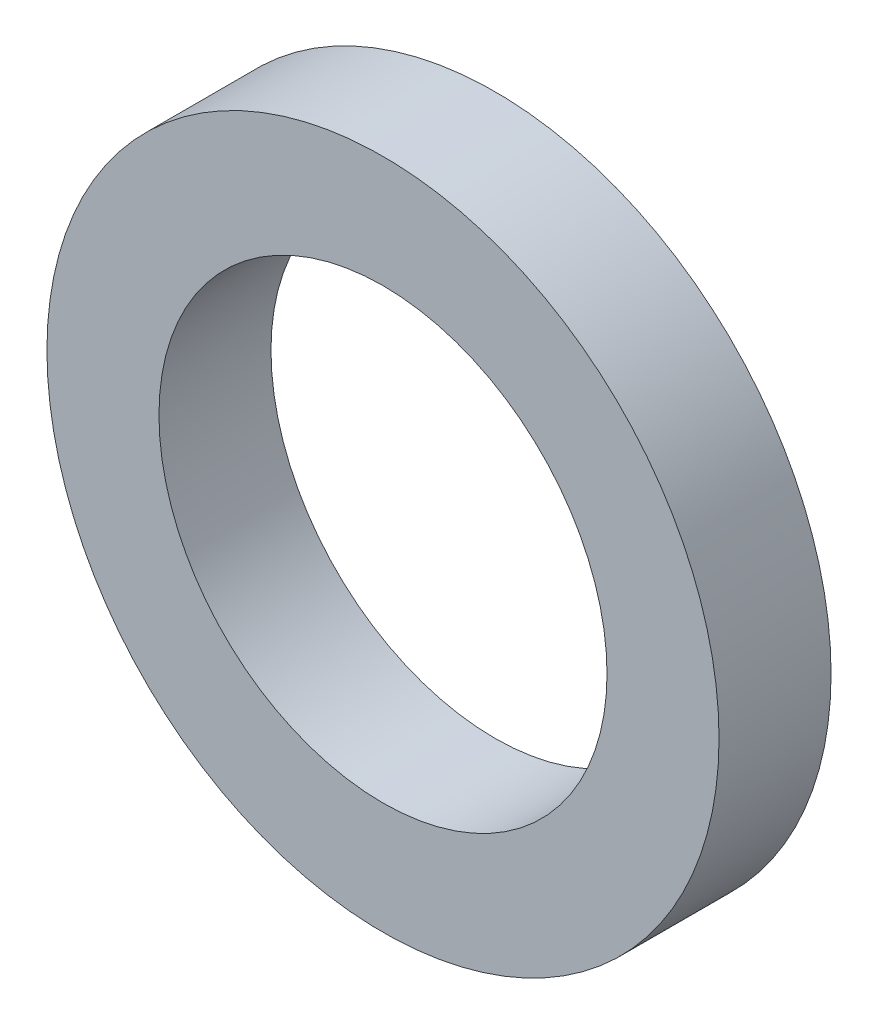
ISO-10303-21;
HEADER;
FILE_DESCRIPTION(('STEP AP214'),'2;1');
FILE_NAME('part.step','',(''),(''),'','','');
FILE_SCHEMA(('AUTOMOTIVE_DESIGN { 1 0 10303 214 1 1 1 1 }'));
ENDSEC;
DATA;
#1=APPLICATION_CONTEXT('core data for automotive mechanical design processes');
#2=APPLICATION_PROTOCOL_DEFINITION('international standard','automotive_design',2000,#1);
#3=PRODUCT_CONTEXT('',#1,'mechanical');
#4=PRODUCT('Part','Part','',(#3));
#5=PRODUCT_RELATED_PRODUCT_CATEGORY('part','',(#4));
#6=PRODUCT_DEFINITION_FORMATION('','',#4);
#7=PRODUCT_DEFINITION_CONTEXT('part definition',#1,'design');
#8=PRODUCT_DEFINITION('design','',#6,#7);
#9=PRODUCT_DEFINITION_SHAPE('','',#8);
#10=(LENGTH_UNIT() NAMED_UNIT(*) SI_UNIT(.MILLI.,.METRE.));
#11=(NAMED_UNIT(*) PLANE_ANGLE_UNIT() SI_UNIT($,.RADIAN.));
#12=(NAMED_UNIT(*) SI_UNIT($,.STERADIAN.) SOLID_ANGLE_UNIT());
#13=UNCERTAINTY_MEASURE_WITH_UNIT(LENGTH_MEASURE(1.E-05),#10,'distance_accuracy_value','');
#14=(GEOMETRIC_REPRESENTATION_CONTEXT(3) GLOBAL_UNCERTAINTY_ASSIGNED_CONTEXT((#13)) GLOBAL_UNIT_ASSIGNED_CONTEXT((#10,
#11,#12)) REPRESENTATION_CONTEXT('',''));
#15=CARTESIAN_POINT('',(0.,0.,0.));
#16=DIRECTION('',(0.,0.,1.));
#17=DIRECTION('',(1.,0.,0.));
#18=AXIS2_PLACEMENT_3D('',#15,#16,#17);
#19=CARTESIAN_POINT('',(0.,0.,4.7625));
#20=DIRECTION('',(0.,0.,1.));
#21=DIRECTION('',(1.,0.,0.));
#22=AXIS2_PLACEMENT_3D('',#19,#20,#21);
#23=PLANE('',#22);
#24=CARTESIAN_POINT('',(0.,0.,4.7625));
#25=DIRECTION('',(0.,0.,1.));
#26=DIRECTION('',(1.,0.,0.));
#27=AXIS2_PLACEMENT_3D('',#24,#25,#26);
#28=CIRCLE('',#27,14.2875);
#29=CARTESIAN_POINT('',(-14.2875,0.,4.7625));
#30=VERTEX_POINT('',#29);
#31=EDGE_CURVE('E10',#30,#30,#28,.T.);
#32=ORIENTED_EDGE('',*,*,#31,.T.);
#33=EDGE_LOOP('',(#32));
#34=FACE_BOUND('',#33,.T.);
#35=CARTESIAN_POINT('',(0.,0.,4.7625));
#36=DIRECTION('',(0.,0.,1.));
#37=DIRECTION('',(1.,0.,0.));
#38=AXIS2_PLACEMENT_3D('',#35,#36,#37);
#39=CIRCLE('',#38,9.525);
#40=CARTESIAN_POINT('',(-9.525,0.,4.7625));
#41=VERTEX_POINT('',#40);
#42=EDGE_CURVE('E41',#41,#41,#39,.T.);
#43=ORIENTED_EDGE('',*,*,#42,.F.);
#44=EDGE_LOOP('',(#43));
#45=FACE_BOUND('',#44,.T.);
#46=ADVANCED_FACE('F30',(#34,#45),#23,.T.);
#47=CARTESIAN_POINT('',(0.,0.,0.));
#48=DIRECTION('',(0.,0.,1.));
#49=DIRECTION('',(1.,0.,0.));
#50=AXIS2_PLACEMENT_3D('',#47,#48,#49);
#51=PLANE('',#50);
#52=CARTESIAN_POINT('',(0.,0.,0.));
#53=DIRECTION('',(0.,0.,1.));
#54=DIRECTION('',(1.,0.,0.));
#55=AXIS2_PLACEMENT_3D('',#52,#53,#54);
#56=CIRCLE('',#55,14.2875);
#57=CARTESIAN_POINT('',(-14.2875,0.,0.));
#58=VERTEX_POINT('',#57);
#59=EDGE_CURVE('E34',#58,#58,#56,.T.);
#60=ORIENTED_EDGE('',*,*,#59,.F.);
#61=EDGE_LOOP('',(#60));
#62=FACE_BOUND('',#61,.T.);
#63=CARTESIAN_POINT('',(0.,0.,0.));
#64=DIRECTION('',(0.,0.,1.));
#65=DIRECTION('',(1.,0.,0.));
#66=AXIS2_PLACEMENT_3D('',#63,#64,#65);
#67=CIRCLE('',#66,9.525);
#68=CARTESIAN_POINT('',(-9.525,0.,0.));
#69=VERTEX_POINT('',#68);
#70=EDGE_CURVE('E43',#69,#69,#67,.T.);
#71=ORIENTED_EDGE('',*,*,#70,.T.);
#72=EDGE_LOOP('',(#71));
#73=FACE_BOUND('',#72,.T.);
#74=ADVANCED_FACE('F53',(#62,#73),#51,.F.);
#75=CARTESIAN_POINT('',(0.,0.,4.7625));
#76=DIRECTION('',(0.,0.,-1.));
#77=DIRECTION('',(-1.,0.,0.));
#78=AXIS2_PLACEMENT_3D('',#75,#76,#77);
#79=CYLINDRICAL_SURFACE('',#78,14.2875);
#80=CARTESIAN_POINT('',(-14.2875,0.,4.7625));
#81=CARTESIAN_POINT('',(-14.2875,0.,4.712890625));
#82=CARTESIAN_POINT('',(-14.2875,0.,4.66328125));
#83=CARTESIAN_POINT('',(-14.2875,0.,4.5640625));
#84=CARTESIAN_POINT('',(-14.2875,0.,4.514453125));
#85=CARTESIAN_POINT('',(-14.2875,0.,4.415234375));
#86=CARTESIAN_POINT('',(-14.2875,0.,4.365625));
#87=CARTESIAN_POINT('',(-14.2875,0.,4.26640625));
#88=CARTESIAN_POINT('',(-14.2875,0.,4.216796875));
#89=CARTESIAN_POINT('',(-14.2875,0.,4.117578125));
#90=CARTESIAN_POINT('',(-14.2875,0.,4.06796875));
#91=CARTESIAN_POINT('',(-14.2875,0.,3.96875));
#92=CARTESIAN_POINT('',(-14.2875,0.,3.919140625));
#93=CARTESIAN_POINT('',(-14.2875,0.,3.819921875));
#94=CARTESIAN_POINT('',(-14.2875,0.,3.7703125));
#95=CARTESIAN_POINT('',(-14.2875,0.,3.67109375));
#96=CARTESIAN_POINT('',(-14.2875,0.,3.621484375));
#97=CARTESIAN_POINT('',(-14.2875,0.,3.522265625));
#98=CARTESIAN_POINT('',(-14.2875,0.,3.47265625));
#99=CARTESIAN_POINT('',(-14.2875,0.,3.3734375));
#100=CARTESIAN_POINT('',(-14.2875,0.,3.323828125));
#101=CARTESIAN_POINT('',(-14.2875,0.,3.224609375));
#102=CARTESIAN_POINT('',(-14.2875,0.,3.175));
#103=CARTESIAN_POINT('',(-14.2875,0.,3.07578125));
#104=CARTESIAN_POINT('',(-14.2875,0.,3.026171875));
#105=CARTESIAN_POINT('',(-14.2875,0.,2.926953125));
#106=CARTESIAN_POINT('',(-14.2875,0.,2.87734375));
#107=CARTESIAN_POINT('',(-14.2875,0.,2.778125));
#108=CARTESIAN_POINT('',(-14.2875,0.,2.728515625));
#109=CARTESIAN_POINT('',(-14.2875,0.,2.629296875));
#110=CARTESIAN_POINT('',(-14.2875,0.,2.5796875));
#111=CARTESIAN_POINT('',(-14.2875,0.,2.48046875));
#112=CARTESIAN_POINT('',(-14.2875,0.,2.430859375));
#113=CARTESIAN_POINT('',(-14.2875,0.,2.331640625));
#114=CARTESIAN_POINT('',(-14.2875,0.,2.28203125));
#115=CARTESIAN_POINT('',(-14.2875,0.,2.1828125));
#116=CARTESIAN_POINT('',(-14.2875,0.,2.133203125));
#117=CARTESIAN_POINT('',(-14.2875,0.,2.033984375));
#118=CARTESIAN_POINT('',(-14.2875,0.,1.984375));
#119=CARTESIAN_POINT('',(-14.2875,0.,1.88515625));
#120=CARTESIAN_POINT('',(-14.2875,0.,1.835546875));
#121=CARTESIAN_POINT('',(-14.2875,0.,1.736328125));
#122=CARTESIAN_POINT('',(-14.2875,0.,1.68671875));
#123=CARTESIAN_POINT('',(-14.2875,0.,1.5875));
#124=CARTESIAN_POINT('',(-14.2875,0.,1.537890625));
#125=CARTESIAN_POINT('',(-14.2875,0.,1.438671875));
#126=CARTESIAN_POINT('',(-14.2875,0.,1.3890625));
#127=CARTESIAN_POINT('',(-14.2875,0.,1.28984375));
#128=CARTESIAN_POINT('',(-14.2875,0.,1.240234375));
#129=CARTESIAN_POINT('',(-14.2875,0.,1.141015625));
#130=CARTESIAN_POINT('',(-14.2875,0.,1.09140625));
#131=CARTESIAN_POINT('',(-14.2875,0.,0.9921875));
#132=CARTESIAN_POINT('',(-14.2875,0.,0.942578125));
#133=CARTESIAN_POINT('',(-14.2875,0.,0.843359375));
#134=CARTESIAN_POINT('',(-14.2875,0.,0.79375));
#135=CARTESIAN_POINT('',(-14.2875,0.,0.69453125));
#136=CARTESIAN_POINT('',(-14.2875,0.,0.644921875));
#137=CARTESIAN_POINT('',(-14.2875,0.,0.545703125));
#138=CARTESIAN_POINT('',(-14.2875,0.,0.49609375));
#139=CARTESIAN_POINT('',(-14.2875,0.,0.396875));
#140=CARTESIAN_POINT('',(-14.2875,0.,0.347265625));
#141=CARTESIAN_POINT('',(-14.2875,0.,0.248046875));
#142=CARTESIAN_POINT('',(-14.2875,0.,0.1984375));
#143=CARTESIAN_POINT('',(-14.2875,0.,0.09921875));
#144=CARTESIAN_POINT('',(-14.2875,0.,0.049609375));
#145=CARTESIAN_POINT('',(-14.2875,0.,0.));
#146=B_SPLINE_CURVE_WITH_KNOTS('',3,(#80,#81,#82,#83,#84,#85,#86,#87,#88,#89,#90,#91,#92,#93,
#94,#95,#96,#97,#98,#99,#100,#101,#102,#103,#104,#105,#106,#107,#108,#109,#110,#111,#112,#113,
#114,#115,#116,#117,#118,#119,#120,#121,#122,#123,#124,#125,#126,#127,#128,#129,#130,#131,#132,
#133,#134,#135,#136,#137,#138,#139,#140,#141,#142,#143,#144,#145),.UNSPECIFIED.,.F.,.F.,(4,2,2,
2,2,2,2,2,2,2,2,2,2,2,2,2,2,2,2,2,2,2,2,2,2,2,2,2,2,2,2,2,4),(0.,0.148828124999999,
0.297656249999999,0.446484374999999,0.595312499999999,0.744140625,0.89296875,1.041796875,
1.190625,1.339453125,1.48828125,1.637109375,1.7859375,1.934765625,2.08359375,2.232421875,
2.38125,2.530078125,2.67890625,2.827734375,2.9765625,3.125390625,3.27421875,3.423046875,
3.571875,3.720703125,3.86953125,4.018359375,4.1671875,4.316015625,4.46484375,4.613671875,
4.7625),.UNSPECIFIED.);
#147=EDGE_CURVE('BSEAM32',#30,#58,#146,.T.);
#148=ORIENTED_EDGE('',*,*,#31,.F.);
#149=ORIENTED_EDGE('',*,*,#59,.T.);
#150=ORIENTED_EDGE('',*,*,#147,.T.);
#151=ORIENTED_EDGE('',*,*,#147,.F.);
#152=EDGE_LOOP('',(#148,#150,#149,#151));
#153=FACE_BOUND('',#152,.T.);
#154=ADVANCED_FACE('F32',(#153),#79,.T.);
#155=CARTESIAN_POINT('',(0.,0.,4.7625));
#156=DIRECTION('',(0.,0.,-1.));
#157=DIRECTION('',(-1.,0.,0.));
#158=AXIS2_PLACEMENT_3D('',#155,#156,#157);
#159=CYLINDRICAL_SURFACE('',#158,9.525);
#160=CARTESIAN_POINT('',(-9.525,0.,4.7625));
#161=CARTESIAN_POINT('',(-9.525,0.,4.712890625));
#162=CARTESIAN_POINT('',(-9.525,0.,4.66328125));
#163=CARTESIAN_POINT('',(-9.525,0.,4.5640625));
#164=CARTESIAN_POINT('',(-9.525,0.,4.514453125));
#165=CARTESIAN_POINT('',(-9.525,0.,4.415234375));
#166=CARTESIAN_POINT('',(-9.525,0.,4.365625));
#167=CARTESIAN_POINT('',(-9.525,0.,4.26640625));
#168=CARTESIAN_POINT('',(-9.525,0.,4.216796875));
#169=CARTESIAN_POINT('',(-9.525,0.,4.117578125));
#170=CARTESIAN_POINT('',(-9.525,0.,4.06796875));
#171=CARTESIAN_POINT('',(-9.525,0.,3.96875));
#172=CARTESIAN_POINT('',(-9.525,0.,3.919140625));
#173=CARTESIAN_POINT('',(-9.525,0.,3.819921875));
#174=CARTESIAN_POINT('',(-9.525,0.,3.7703125));
#175=CARTESIAN_POINT('',(-9.525,0.,3.67109375));
#176=CARTESIAN_POINT('',(-9.525,0.,3.621484375));
#177=CARTESIAN_POINT('',(-9.525,0.,3.522265625));
#178=CARTESIAN_POINT('',(-9.525,0.,3.47265625));
#179=CARTESIAN_POINT('',(-9.525,0.,3.3734375));
#180=CARTESIAN_POINT('',(-9.525,0.,3.323828125));
#181=CARTESIAN_POINT('',(-9.525,0.,3.224609375));
#182=CARTESIAN_POINT('',(-9.525,0.,3.175));
#183=CARTESIAN_POINT('',(-9.525,0.,3.07578125));
#184=CARTESIAN_POINT('',(-9.525,0.,3.026171875));
#185=CARTESIAN_POINT('',(-9.525,0.,2.926953125));
#186=CARTESIAN_POINT('',(-9.525,0.,2.87734375));
#187=CARTESIAN_POINT('',(-9.525,0.,2.778125));
#188=CARTESIAN_POINT('',(-9.525,0.,2.728515625));
#189=CARTESIAN_POINT('',(-9.525,0.,2.629296875));
#190=CARTESIAN_POINT('',(-9.525,0.,2.5796875));
#191=CARTESIAN_POINT('',(-9.525,0.,2.48046875));
#192=CARTESIAN_POINT('',(-9.525,0.,2.430859375));
#193=CARTESIAN_POINT('',(-9.525,0.,2.331640625));
#194=CARTESIAN_POINT('',(-9.525,0.,2.28203125));
#195=CARTESIAN_POINT('',(-9.525,0.,2.1828125));
#196=CARTESIAN_POINT('',(-9.525,0.,2.133203125));
#197=CARTESIAN_POINT('',(-9.525,0.,2.033984375));
#198=CARTESIAN_POINT('',(-9.525,0.,1.984375));
#199=CARTESIAN_POINT('',(-9.525,0.,1.88515625));
#200=CARTESIAN_POINT('',(-9.525,0.,1.835546875));
#201=CARTESIAN_POINT('',(-9.525,0.,1.736328125));
#202=CARTESIAN_POINT('',(-9.525,0.,1.68671875));
#203=CARTESIAN_POINT('',(-9.525,0.,1.5875));
#204=CARTESIAN_POINT('',(-9.525,0.,1.537890625));
#205=CARTESIAN_POINT('',(-9.525,0.,1.438671875));
#206=CARTESIAN_POINT('',(-9.525,0.,1.3890625));
#207=CARTESIAN_POINT('',(-9.525,0.,1.28984375));
#208=CARTESIAN_POINT('',(-9.525,0.,1.240234375));
#209=CARTESIAN_POINT('',(-9.525,0.,1.141015625));
#210=CARTESIAN_POINT('',(-9.525,0.,1.09140625));
#211=CARTESIAN_POINT('',(-9.525,0.,0.992187499999999));
#212=CARTESIAN_POINT('',(-9.525,0.,0.942578124999999));
#213=CARTESIAN_POINT('',(-9.525,0.,0.843359375));
#214=CARTESIAN_POINT('',(-9.525,0.,0.79375));
#215=CARTESIAN_POINT('',(-9.525,0.,0.69453125));
#216=CARTESIAN_POINT('',(-9.525,0.,0.644921875));
#217=CARTESIAN_POINT('',(-9.525,0.,0.545703125));
#218=CARTESIAN_POINT('',(-9.525,0.,0.49609375));
#219=CARTESIAN_POINT('',(-9.525,0.,0.396875));
#220=CARTESIAN_POINT('',(-9.525,0.,0.347265625));
#221=CARTESIAN_POINT('',(-9.525,0.,0.248046875));
#222=CARTESIAN_POINT('',(-9.525,0.,0.1984375));
#223=CARTESIAN_POINT('',(-9.525,0.,0.09921875));
#224=CARTESIAN_POINT('',(-9.525,0.,0.049609375));
#225=CARTESIAN_POINT('',(-9.525,0.,0.));
#226=B_SPLINE_CURVE_WITH_KNOTS('',3,(#160,#161,#162,#163,#164,#165,#166,#167,#168,#169,#170,
#171,#172,#173,#174,#175,#176,#177,#178,#179,#180,#181,#182,#183,#184,#185,#186,#187,#188,#189,
#190,#191,#192,#193,#194,#195,#196,#197,#198,#199,#200,#201,#202,#203,#204,#205,#206,#207,#208,
#209,#210,#211,#212,#213,#214,#215,#216,#217,#218,#219,#220,#221,#222,#223,#224,#225),
.UNSPECIFIED.,.F.,.F.,(4,2,2,2,2,2,2,2,2,2,2,2,2,2,2,2,2,2,2,2,2,2,2,2,2,2,2,2,2,2,2,2,4),(0.,
0.148828125,0.29765625,0.446484375,0.5953125,0.744140625,0.892968750000001,1.041796875,1.190625,
1.339453125,1.48828125,1.637109375,1.7859375,1.934765625,2.08359375,2.232421875,2.38125,
2.530078125,2.67890625,2.827734375,2.9765625,3.125390625,3.27421875,3.423046875,3.571875,
3.720703125,3.86953125,4.018359375,4.1671875,4.316015625,4.46484375,4.613671875,4.7625),.UNSPECIFIED.);
#227=EDGE_CURVE('BSEAM49',#41,#69,#226,.T.);
#228=ORIENTED_EDGE('',*,*,#42,.T.);
#229=ORIENTED_EDGE('',*,*,#70,.F.);
#230=ORIENTED_EDGE('',*,*,#227,.T.);
#231=ORIENTED_EDGE('',*,*,#227,.F.);
#232=EDGE_LOOP('',(#228,#230,#229,#231));
#233=FACE_BOUND('',#232,.T.);
#234=ADVANCED_FACE('F49',(#233),#159,.F.);
#235=CLOSED_SHELL('',(#46,#74,#154,#234));
#236=MANIFOLD_SOLID_BREP('B2',#235);
#237=ADVANCED_BREP_SHAPE_REPRESENTATION('',(#18,#236),#14);
#238=SHAPE_DEFINITION_REPRESENTATION(#9,#237);
ENDSEC;
END-ISO-10303-21;
